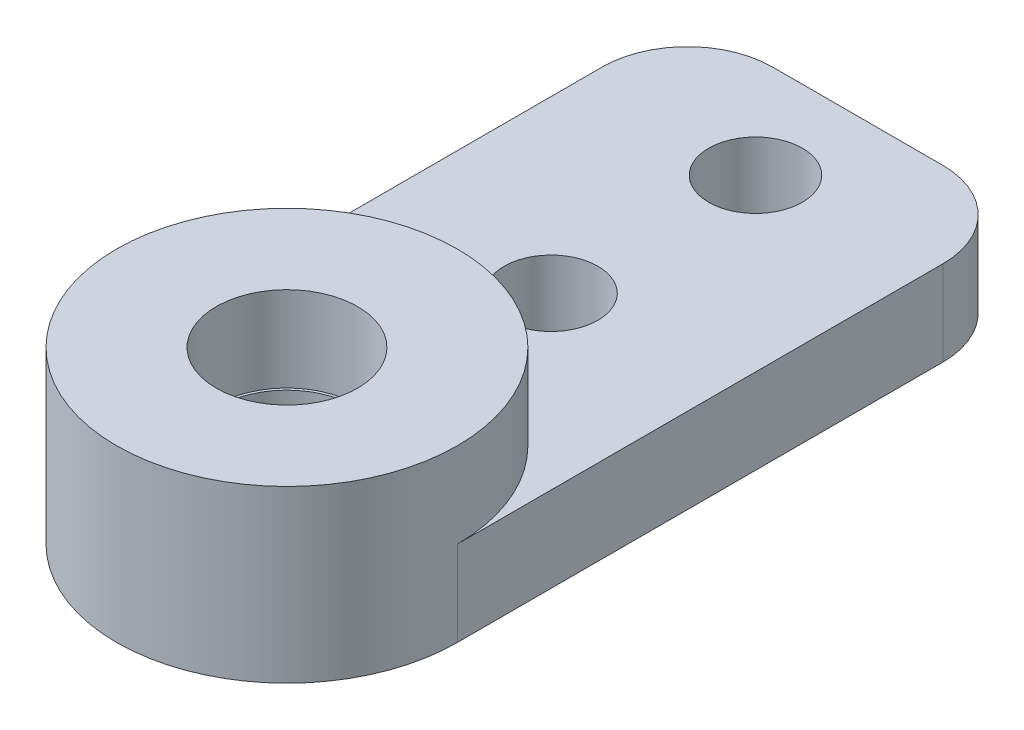
ISO-10303-21;
HEADER;
FILE_DESCRIPTION(('STEP AP214'),'2;1');
FILE_NAME('part.step','',(''),(''),'','','');
FILE_SCHEMA(('AUTOMOTIVE_DESIGN { 1 0 10303 214 1 1 1 1 }'));
ENDSEC;
DATA;
#1=APPLICATION_CONTEXT('core data for automotive mechanical design processes');
#2=APPLICATION_PROTOCOL_DEFINITION('international standard','automotive_design',2000,#1);
#3=PRODUCT_CONTEXT('',#1,'mechanical');
#4=PRODUCT('Part','Part','',(#3));
#5=PRODUCT_RELATED_PRODUCT_CATEGORY('part','',(#4));
#6=PRODUCT_DEFINITION_FORMATION('','',#4);
#7=PRODUCT_DEFINITION_CONTEXT('part definition',#1,'design');
#8=PRODUCT_DEFINITION('design','',#6,#7);
#9=PRODUCT_DEFINITION_SHAPE('','',#8);
#10=(LENGTH_UNIT() NAMED_UNIT(*) SI_UNIT(.MILLI.,.METRE.));
#11=(NAMED_UNIT(*) PLANE_ANGLE_UNIT() SI_UNIT($,.RADIAN.));
#12=(NAMED_UNIT(*) SI_UNIT($,.STERADIAN.) SOLID_ANGLE_UNIT());
#13=UNCERTAINTY_MEASURE_WITH_UNIT(LENGTH_MEASURE(1.E-05),#10,'distance_accuracy_value','');
#14=(GEOMETRIC_REPRESENTATION_CONTEXT(3) GLOBAL_UNCERTAINTY_ASSIGNED_CONTEXT((#13)) GLOBAL_UNIT_ASSIGNED_CONTEXT((#10,
#11,#12)) REPRESENTATION_CONTEXT('',''));
#15=CARTESIAN_POINT('',(0.,0.,0.));
#16=DIRECTION('',(0.,0.,1.));
#17=DIRECTION('',(1.,0.,0.));
#18=AXIS2_PLACEMENT_3D('',#15,#16,#17);
#19=CARTESIAN_POINT('',(0.,5.,0.));
#20=DIRECTION('',(0.,1.,0.));
#21=DIRECTION('',(0.,0.,1.));
#22=AXIS2_PLACEMENT_3D('',#19,#20,#21);
#23=PLANE('',#22);
#24=CARTESIAN_POINT('',(0.,5.,0.));
#25=DIRECTION('',(0.,1.,0.));
#26=DIRECTION('',(0.,0.,1.));
#27=AXIS2_PLACEMENT_3D('',#24,#25,#26);
#28=CIRCLE('',#27,4.);
#29=CARTESIAN_POINT('',(0.,5.,4.));
#30=VERTEX_POINT('',#29);
#31=EDGE_CURVE('E134',#30,#30,#28,.T.);
#32=ORIENTED_EDGE('',*,*,#31,.F.);
#33=EDGE_LOOP('',(#32));
#34=FACE_BOUND('',#33,.T.);
#35=CARTESIAN_POINT('',(0.,5.,0.));
#36=DIRECTION('',(0.,1.,0.));
#37=DIRECTION('',(0.,0.,1.));
#38=AXIS2_PLACEMENT_3D('',#35,#36,#37);
#39=CIRCLE('',#38,4.15);
#40=CARTESIAN_POINT('',(0.,5.,4.15));
#41=VERTEX_POINT('',#40);
#42=EDGE_CURVE('E130',#41,#41,#39,.T.);
#43=ORIENTED_EDGE('',*,*,#42,.T.);
#44=EDGE_LOOP('',(#43));
#45=FACE_BOUND('',#44,.T.);
#46=ADVANCED_FACE('F39',(#34,#45),#23,.T.);
#47=DIRECTION('',(0.,0.,-1.));
#48=VECTOR('',#47,1.);
#49=CARTESIAN_POINT('',(10.,5.,0.));
#50=LINE('',#49,#48);
#51=CARTESIAN_POINT('',(10.,5.,0.));
#52=VERTEX_POINT('',#51);
#53=CARTESIAN_POINT('',(10.,5.,-28.5));
#54=VERTEX_POINT('',#53);
#55=EDGE_CURVE('E109',#52,#54,#50,.T.);
#56=ORIENTED_EDGE('',*,*,#55,.T.);
#57=CARTESIAN_POINT('',(5.,5.,-28.5));
#58=DIRECTION('',(0.,1.,0.));
#59=DIRECTION('',(0.,0.,1.));
#60=AXIS2_PLACEMENT_3D('',#57,#58,#59);
#61=CIRCLE('',#60,5.);
#62=CARTESIAN_POINT('',(5.,5.,-33.5));
#63=VERTEX_POINT('',#62);
#64=EDGE_CURVE('E48',#54,#63,#61,.T.);
#65=ORIENTED_EDGE('',*,*,#64,.T.);
#66=DIRECTION('',(-1.,0.,0.));
#67=VECTOR('',#66,1.);
#68=CARTESIAN_POINT('',(-10.,5.,-33.5));
#69=LINE('',#68,#67);
#70=CARTESIAN_POINT('',(-5.,5.,-33.5));
#71=VERTEX_POINT('',#70);
#72=EDGE_CURVE('E113',#63,#71,#69,.T.);
#73=ORIENTED_EDGE('',*,*,#72,.T.);
#74=CARTESIAN_POINT('',(-5.,5.,-28.5));
#75=DIRECTION('',(0.,1.,0.));
#76=DIRECTION('',(0.,0.,1.));
#77=AXIS2_PLACEMENT_3D('',#74,#75,#76);
#78=CIRCLE('',#77,5.);
#79=CARTESIAN_POINT('',(-10.,5.,-28.5));
#80=VERTEX_POINT('',#79);
#81=EDGE_CURVE('E55',#71,#80,#78,.T.);
#82=ORIENTED_EDGE('',*,*,#81,.T.);
#83=DIRECTION('',(0.,0.,1.));
#84=VECTOR('',#83,1.);
#85=CARTESIAN_POINT('',(-10.,5.,0.));
#86=LINE('',#85,#84);
#87=CARTESIAN_POINT('',(-10.,5.,0.));
#88=VERTEX_POINT('',#87);
#89=EDGE_CURVE('E118',#80,#88,#86,.T.);
#90=ORIENTED_EDGE('',*,*,#89,.T.);
#91=CARTESIAN_POINT('',(0.,5.,0.));
#92=DIRECTION('',(0.,1.,0.));
#93=DIRECTION('',(0.,0.,1.));
#94=AXIS2_PLACEMENT_3D('',#91,#92,#93);
#95=CIRCLE('',#94,10.);
#96=EDGE_CURVE('E102',#52,#88,#95,.T.);
#97=ORIENTED_EDGE('',*,*,#96,.F.);
#98=EDGE_LOOP('',(#56,#65,#73,#82,#90,#97));
#99=FACE_BOUND('',#98,.T.);
#100=CARTESIAN_POINT('',(0.,5.,-15.5));
#101=DIRECTION('',(0.,1.,0.));
#102=DIRECTION('',(0.,0.,1.));
#103=AXIS2_PLACEMENT_3D('',#100,#101,#102);
#104=CIRCLE('',#103,2.75);
#105=CARTESIAN_POINT('',(0.,5.,-12.75));
#106=VERTEX_POINT('',#105);
#107=EDGE_CURVE('E142',#106,#106,#104,.T.);
#108=ORIENTED_EDGE('',*,*,#107,.F.);
#109=EDGE_LOOP('',(#108));
#110=FACE_BOUND('',#109,.T.);
#111=CARTESIAN_POINT('',(0.,5.,-27.5));
#112=DIRECTION('',(0.,1.,0.));
#113=DIRECTION('',(0.,0.,1.));
#114=AXIS2_PLACEMENT_3D('',#111,#112,#113);
#115=CIRCLE('',#114,2.75);
#116=CARTESIAN_POINT('',(0.,5.,-24.75));
#117=VERTEX_POINT('',#116);
#118=EDGE_CURVE('E150',#117,#117,#115,.T.);
#119=ORIENTED_EDGE('',*,*,#118,.F.);
#120=EDGE_LOOP('',(#119));
#121=FACE_BOUND('',#120,.T.);
#122=ADVANCED_FACE('F116',(#99,#110,#121),#23,.T.);
#123=CARTESIAN_POINT('',(0.,0.,0.));
#124=DIRECTION('',(0.,1.,0.));
#125=DIRECTION('',(0.,0.,1.));
#126=AXIS2_PLACEMENT_3D('',#123,#124,#125);
#127=PLANE('',#126);
#128=DIRECTION('',(-1.,0.,0.));
#129=VECTOR('',#128,1.);
#130=CARTESIAN_POINT('',(-10.,0.,-33.5));
#131=LINE('',#130,#129);
#132=CARTESIAN_POINT('',(5.,0.,-33.5));
#133=VERTEX_POINT('',#132);
#134=CARTESIAN_POINT('',(-5.,0.,-33.5));
#135=VERTEX_POINT('',#134);
#136=EDGE_CURVE('E166',#133,#135,#131,.T.);
#137=ORIENTED_EDGE('',*,*,#136,.F.);
#138=CARTESIAN_POINT('',(5.,0.,-28.5));
#139=DIRECTION('',(0.,1.,0.));
#140=DIRECTION('',(0.,0.,1.));
#141=AXIS2_PLACEMENT_3D('',#138,#139,#140);
#142=CIRCLE('',#141,5.);
#143=CARTESIAN_POINT('',(10.,0.,-28.5));
#144=VERTEX_POINT('',#143);
#145=EDGE_CURVE('E183',#133,#144,#142,.F.);
#146=ORIENTED_EDGE('',*,*,#145,.T.);
#147=DIRECTION('',(0.,0.,-1.));
#148=VECTOR('',#147,1.);
#149=CARTESIAN_POINT('',(10.,0.,0.));
#150=LINE('',#149,#148);
#151=CARTESIAN_POINT('',(10.,0.,0.));
#152=VERTEX_POINT('',#151);
#153=EDGE_CURVE('E163',#152,#144,#150,.T.);
#154=ORIENTED_EDGE('',*,*,#153,.F.);
#155=CARTESIAN_POINT('',(0.,0.,0.));
#156=DIRECTION('',(0.,1.,0.));
#157=DIRECTION('',(0.,0.,1.));
#158=AXIS2_PLACEMENT_3D('',#155,#156,#157);
#159=CIRCLE('',#158,10.);
#160=CARTESIAN_POINT('',(-10.,0.,0.));
#161=VERTEX_POINT('',#160);
#162=EDGE_CURVE('E104',#161,#152,#159,.T.);
#163=ORIENTED_EDGE('',*,*,#162,.F.);
#164=DIRECTION('',(0.,0.,1.));
#165=VECTOR('',#164,1.);
#166=CARTESIAN_POINT('',(-10.,0.,0.));
#167=LINE('',#166,#165);
#168=CARTESIAN_POINT('',(-10.,0.,-28.5));
#169=VERTEX_POINT('',#168);
#170=EDGE_CURVE('E114',#169,#161,#167,.T.);
#171=ORIENTED_EDGE('',*,*,#170,.F.);
#172=CARTESIAN_POINT('',(-5.,0.,-28.5));
#173=DIRECTION('',(0.,1.,0.));
#174=DIRECTION('',(0.,0.,1.));
#175=AXIS2_PLACEMENT_3D('',#172,#173,#174);
#176=CIRCLE('',#175,5.);
#177=EDGE_CURVE('E180',#169,#135,#176,.F.);
#178=ORIENTED_EDGE('',*,*,#177,.T.);
#179=EDGE_LOOP('',(#137,#146,#154,#163,#171,#178));
#180=FACE_BOUND('',#179,.T.);
#181=CARTESIAN_POINT('',(0.,0.,-27.5));
#182=DIRECTION('',(0.,1.,0.));
#183=DIRECTION('',(0.,0.,1.));
#184=AXIS2_PLACEMENT_3D('',#181,#182,#183);
#185=CIRCLE('',#184,2.75);
#186=CARTESIAN_POINT('',(0.,0.,-24.75));
#187=VERTEX_POINT('',#186);
#188=EDGE_CURVE('E146',#187,#187,#185,.T.);
#189=ORIENTED_EDGE('',*,*,#188,.T.);
#190=EDGE_LOOP('',(#189));
#191=FACE_BOUND('',#190,.T.);
#192=CARTESIAN_POINT('',(0.,0.,-15.5));
#193=DIRECTION('',(0.,1.,0.));
#194=DIRECTION('',(0.,0.,1.));
#195=AXIS2_PLACEMENT_3D('',#192,#193,#194);
#196=CIRCLE('',#195,2.75);
#197=CARTESIAN_POINT('',(0.,0.,-12.75));
#198=VERTEX_POINT('',#197);
#199=EDGE_CURVE('E138',#198,#198,#196,.T.);
#200=ORIENTED_EDGE('',*,*,#199,.T.);
#201=EDGE_LOOP('',(#200));
#202=FACE_BOUND('',#201,.T.);
#203=CARTESIAN_POINT('',(0.,0.,0.));
#204=DIRECTION('',(0.,1.,0.));
#205=DIRECTION('',(0.,0.,1.));
#206=AXIS2_PLACEMENT_3D('',#203,#204,#205);
#207=CIRCLE('',#206,4.);
#208=CARTESIAN_POINT('',(0.,0.,4.));
#209=VERTEX_POINT('',#208);
#210=EDGE_CURVE('E127',#209,#209,#207,.T.);
#211=ORIENTED_EDGE('',*,*,#210,.T.);
#212=EDGE_LOOP('',(#211));
#213=FACE_BOUND('',#212,.T.);
#214=ADVANCED_FACE('F199',(#180,#191,#202,#213),#127,.F.);
#215=CARTESIAN_POINT('',(0.,5.,0.));
#216=DIRECTION('',(0.,-1.,0.));
#217=DIRECTION('',(0.,0.,-1.));
#218=AXIS2_PLACEMENT_3D('',#215,#216,#217);
#219=CYLINDRICAL_SURFACE('',#218,10.);
#220=ORIENTED_EDGE('',*,*,#162,.T.);
#221=DIRECTION('',(0.,-1.,0.));
#222=VECTOR('',#221,1.);
#223=CARTESIAN_POINT('',(10.,5.,0.));
#224=LINE('',#223,#222);
#225=EDGE_CURVE('E97',#52,#152,#224,.T.);
#226=ORIENTED_EDGE('',*,*,#225,.F.);
#227=ORIENTED_EDGE('',*,*,#96,.T.);
#228=DIRECTION('',(0.,-1.,0.));
#229=VECTOR('',#228,1.);
#230=CARTESIAN_POINT('',(-10.,5.,0.));
#231=LINE('',#230,#229);
#232=EDGE_CURVE('E107',#88,#161,#231,.T.);
#233=ORIENTED_EDGE('',*,*,#232,.T.);
#234=EDGE_LOOP('',(#220,#226,#227,#233));
#235=FACE_BOUND('',#234,.T.);
#236=CARTESIAN_POINT('',(0.,10.,0.));
#237=DIRECTION('',(0.,1.,0.));
#238=DIRECTION('',(0.,0.,1.));
#239=AXIS2_PLACEMENT_3D('',#236,#237,#238);
#240=CIRCLE('',#239,10.);
#241=CARTESIAN_POINT('',(0.,10.,10.));
#242=VERTEX_POINT('',#241);
#243=EDGE_CURVE('E121',#242,#242,#240,.T.);
#244=ORIENTED_EDGE('',*,*,#243,.F.);
#245=EDGE_LOOP('',(#244));
#246=FACE_BOUND('',#245,.T.);
#247=ADVANCED_FACE('F98',(#235,#246),#219,.T.);
#248=CARTESIAN_POINT('',(10.,5.,0.));
#249=DIRECTION('',(-1.,0.,0.));
#250=DIRECTION('',(0.,0.,1.));
#251=AXIS2_PLACEMENT_3D('',#248,#249,#250);
#252=PLANE('',#251);
#253=ORIENTED_EDGE('',*,*,#153,.T.);
#254=DIRECTION('',(0.,-1.,0.));
#255=VECTOR('',#254,1.);
#256=CARTESIAN_POINT('',(10.,5.,-28.5));
#257=LINE('',#256,#255);
#258=EDGE_CURVE('E63',#144,#54,#257,.F.);
#259=ORIENTED_EDGE('',*,*,#258,.T.);
#260=ORIENTED_EDGE('',*,*,#55,.F.);
#261=ORIENTED_EDGE('',*,*,#225,.T.);
#262=EDGE_LOOP('',(#253,#259,#260,#261));
#263=FACE_BOUND('',#262,.T.);
#264=ADVANCED_FACE('F110',(#263),#252,.F.);
#265=CARTESIAN_POINT('',(-10.,5.,-33.5));
#266=DIRECTION('',(0.,0.,1.));
#267=DIRECTION('',(1.,0.,0.));
#268=AXIS2_PLACEMENT_3D('',#265,#266,#267);
#269=PLANE('',#268);
#270=ORIENTED_EDGE('',*,*,#72,.F.);
#271=DIRECTION('',(0.,-1.,0.));
#272=VECTOR('',#271,1.);
#273=CARTESIAN_POINT('',(5.,5.,-33.5));
#274=LINE('',#273,#272);
#275=EDGE_CURVE('E176',#63,#133,#274,.T.);
#276=ORIENTED_EDGE('',*,*,#275,.T.);
#277=ORIENTED_EDGE('',*,*,#136,.T.);
#278=DIRECTION('',(0.,-1.,0.));
#279=VECTOR('',#278,1.);
#280=CARTESIAN_POINT('',(-5.,5.,-33.5));
#281=LINE('',#280,#279);
#282=EDGE_CURVE('E106',#135,#71,#281,.F.);
#283=ORIENTED_EDGE('',*,*,#282,.T.);
#284=EDGE_LOOP('',(#270,#276,#277,#283));
#285=FACE_BOUND('',#284,.T.);
#286=ADVANCED_FACE('F194',(#285),#269,.F.);
#287=CARTESIAN_POINT('',(-10.,5.,0.));
#288=DIRECTION('',(1.,0.,0.));
#289=DIRECTION('',(0.,0.,-1.));
#290=AXIS2_PLACEMENT_3D('',#287,#288,#289);
#291=PLANE('',#290);
#292=ORIENTED_EDGE('',*,*,#89,.F.);
#293=DIRECTION('',(0.,-1.,0.));
#294=VECTOR('',#293,1.);
#295=CARTESIAN_POINT('',(-10.,5.,-28.5));
#296=LINE('',#295,#294);
#297=EDGE_CURVE('E11',#80,#169,#296,.T.);
#298=ORIENTED_EDGE('',*,*,#297,.T.);
#299=ORIENTED_EDGE('',*,*,#170,.T.);
#300=ORIENTED_EDGE('',*,*,#232,.F.);
#301=EDGE_LOOP('',(#292,#298,#299,#300));
#302=FACE_BOUND('',#301,.T.);
#303=ADVANCED_FACE('F205',(#302),#291,.F.);
#304=CARTESIAN_POINT('',(0.,5.,-27.5));
#305=DIRECTION('',(0.,-1.,0.));
#306=DIRECTION('',(0.,0.,-1.));
#307=AXIS2_PLACEMENT_3D('',#304,#305,#306);
#308=CYLINDRICAL_SURFACE('',#307,2.75);
#309=ORIENTED_EDGE('',*,*,#118,.T.);
#310=EDGE_LOOP('',(#309));
#311=FACE_BOUND('',#310,.T.);
#312=ORIENTED_EDGE('',*,*,#188,.F.);
#313=EDGE_LOOP('',(#312));
#314=FACE_BOUND('',#313,.T.);
#315=ADVANCED_FACE('F207',(#311,#314),#308,.F.);
#316=CARTESIAN_POINT('',(0.,5.,-15.5));
#317=DIRECTION('',(0.,-1.,0.));
#318=DIRECTION('',(0.,0.,-1.));
#319=AXIS2_PLACEMENT_3D('',#316,#317,#318);
#320=CYLINDRICAL_SURFACE('',#319,2.75);
#321=ORIENTED_EDGE('',*,*,#107,.T.);
#322=EDGE_LOOP('',(#321));
#323=FACE_BOUND('',#322,.T.);
#324=ORIENTED_EDGE('',*,*,#199,.F.);
#325=EDGE_LOOP('',(#324));
#326=FACE_BOUND('',#325,.T.);
#327=ADVANCED_FACE('F213',(#323,#326),#320,.F.);
#328=CARTESIAN_POINT('',(0.,5.,0.));
#329=DIRECTION('',(0.,-1.,0.));
#330=DIRECTION('',(0.,0.,-1.));
#331=AXIS2_PLACEMENT_3D('',#328,#329,#330);
#332=CYLINDRICAL_SURFACE('',#331,4.);
#333=ORIENTED_EDGE('',*,*,#31,.T.);
#334=EDGE_LOOP('',(#333));
#335=FACE_BOUND('',#334,.T.);
#336=ORIENTED_EDGE('',*,*,#210,.F.);
#337=EDGE_LOOP('',(#336));
#338=FACE_BOUND('',#337,.T.);
#339=ADVANCED_FACE('F248',(#335,#338),#332,.F.);
#340=CARTESIAN_POINT('',(0.,10.,0.));
#341=DIRECTION('',(0.,1.,0.));
#342=DIRECTION('',(0.,0.,1.));
#343=AXIS2_PLACEMENT_3D('',#340,#341,#342);
#344=PLANE('',#343);
#345=ORIENTED_EDGE('',*,*,#243,.T.);
#346=EDGE_LOOP('',(#345));
#347=FACE_BOUND('',#346,.T.);
#348=CARTESIAN_POINT('',(0.,10.,0.));
#349=DIRECTION('',(0.,1.,0.));
#350=DIRECTION('',(0.,0.,1.));
#351=AXIS2_PLACEMENT_3D('',#348,#349,#350);
#352=CIRCLE('',#351,4.15);
#353=CARTESIAN_POINT('',(0.,10.,4.15));
#354=VERTEX_POINT('',#353);
#355=EDGE_CURVE('E122',#354,#354,#352,.T.);
#356=ORIENTED_EDGE('',*,*,#355,.F.);
#357=EDGE_LOOP('',(#356));
#358=FACE_BOUND('',#357,.T.);
#359=ADVANCED_FACE('F242',(#347,#358),#344,.T.);
#360=CARTESIAN_POINT('',(0.,10.,0.));
#361=DIRECTION('',(0.,-1.,0.));
#362=DIRECTION('',(0.,0.,-1.));
#363=AXIS2_PLACEMENT_3D('',#360,#361,#362);
#364=CYLINDRICAL_SURFACE('',#363,4.15);
#365=ORIENTED_EDGE('',*,*,#355,.T.);
#366=EDGE_LOOP('',(#365));
#367=FACE_BOUND('',#366,.T.);
#368=ORIENTED_EDGE('',*,*,#42,.F.);
#369=EDGE_LOOP('',(#368));
#370=FACE_BOUND('',#369,.T.);
#371=ADVANCED_FACE('F237',(#367,#370),#364,.F.);
#372=CARTESIAN_POINT('',(5.,5.,-28.5));
#373=DIRECTION('',(0.,-1.,0.));
#374=DIRECTION('',(0.,0.,-1.));
#375=AXIS2_PLACEMENT_3D('',#372,#373,#374);
#376=CYLINDRICAL_SURFACE('',#375,5.);
#377=ORIENTED_EDGE('',*,*,#64,.F.);
#378=ORIENTED_EDGE('',*,*,#258,.F.);
#379=ORIENTED_EDGE('',*,*,#145,.F.);
#380=ORIENTED_EDGE('',*,*,#275,.F.);
#381=EDGE_LOOP('',(#377,#378,#379,#380));
#382=FACE_BOUND('',#381,.T.);
#383=ADVANCED_FACE('F197',(#382),#376,.T.);
#384=CARTESIAN_POINT('',(-5.,5.,-28.5));
#385=DIRECTION('',(0.,-1.,0.));
#386=DIRECTION('',(0.,0.,-1.));
#387=AXIS2_PLACEMENT_3D('',#384,#385,#386);
#388=CYLINDRICAL_SURFACE('',#387,5.);
#389=ORIENTED_EDGE('',*,*,#81,.F.);
#390=ORIENTED_EDGE('',*,*,#282,.F.);
#391=ORIENTED_EDGE('',*,*,#177,.F.);
#392=ORIENTED_EDGE('',*,*,#297,.F.);
#393=EDGE_LOOP('',(#389,#390,#391,#392));
#394=FACE_BOUND('',#393,.T.);
#395=ADVANCED_FACE('F41',(#394),#388,.T.);
#396=CLOSED_SHELL('',(#46,#122,#214,#247,#264,#286,#303,#315,#327,#339,#359,#371,#383,#395));
#397=MANIFOLD_SOLID_BREP('B2',#396);
#398=ADVANCED_BREP_SHAPE_REPRESENTATION('',(#18,#397),#14);
#399=SHAPE_DEFINITION_REPRESENTATION(#9,#398);
ENDSEC;
END-ISO-10303-21;
